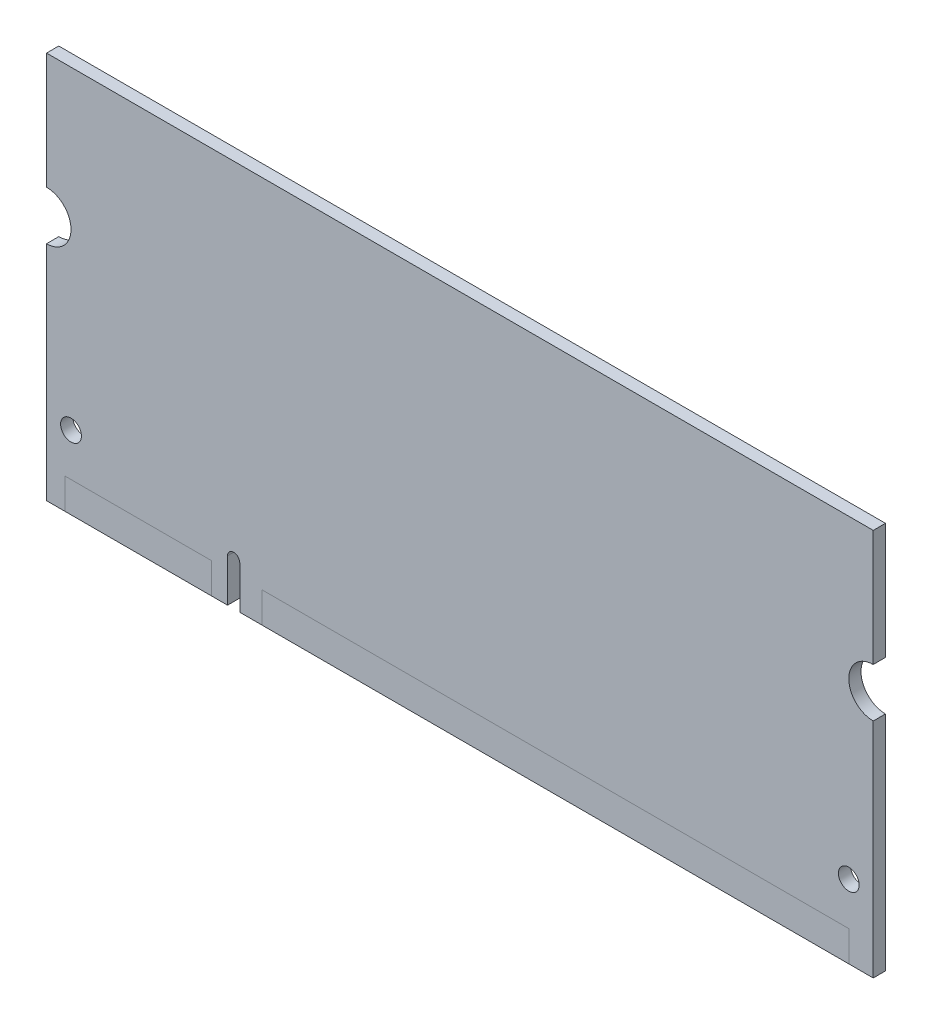
ISO-10303-21;
HEADER;
FILE_DESCRIPTION(('STEP AP214'),'2;1');
FILE_NAME('part.step','',(''),(''),'','','');
FILE_SCHEMA(('AUTOMOTIVE_DESIGN { 1 0 10303 214 1 1 1 1 }'));
ENDSEC;
DATA;
#1=APPLICATION_CONTEXT('core data for automotive mechanical design processes');
#2=APPLICATION_PROTOCOL_DEFINITION('international standard','automotive_design',2000,#1);
#3=PRODUCT_CONTEXT('',#1,'mechanical');
#4=PRODUCT('Part','Part','',(#3));
#5=PRODUCT_RELATED_PRODUCT_CATEGORY('part','',(#4));
#6=PRODUCT_DEFINITION_FORMATION('','',#4);
#7=PRODUCT_DEFINITION_CONTEXT('part definition',#1,'design');
#8=PRODUCT_DEFINITION('design','',#6,#7);
#9=PRODUCT_DEFINITION_SHAPE('','',#8);
#10=(LENGTH_UNIT() NAMED_UNIT(*) SI_UNIT(.MILLI.,.METRE.));
#11=(NAMED_UNIT(*) PLANE_ANGLE_UNIT() SI_UNIT($,.RADIAN.));
#12=(NAMED_UNIT(*) SI_UNIT($,.STERADIAN.) SOLID_ANGLE_UNIT());
#13=UNCERTAINTY_MEASURE_WITH_UNIT(LENGTH_MEASURE(1.E-05),#10,'distance_accuracy_value','');
#14=(GEOMETRIC_REPRESENTATION_CONTEXT(3) GLOBAL_UNCERTAINTY_ASSIGNED_CONTEXT((#13)) GLOBAL_UNIT_ASSIGNED_CONTEXT((#10,
#11,#12)) REPRESENTATION_CONTEXT('',''));
#15=CARTESIAN_POINT('',(0.,0.,0.));
#16=DIRECTION('',(0.,0.,1.));
#17=DIRECTION('',(1.,0.,0.));
#18=AXIS2_PLACEMENT_3D('',#15,#16,#17);
#19=CARTESIAN_POINT('',(-33.8,-15.85,-0.5));
#20=DIRECTION('',(0.,0.,1.));
#21=DIRECTION('',(1.,0.,0.));
#22=AXIS2_PLACEMENT_3D('',#19,#20,#21);
#23=PLANE('',#22);
#24=CARTESIAN_POINT('',(31.8,-9.85,-0.5));
#25=DIRECTION('',(0.,0.,1.));
#26=DIRECTION('',(1.,0.,0.));
#27=AXIS2_PLACEMENT_3D('',#24,#25,#26);
#28=CIRCLE('',#27,0.849999999999997);
#29=CARTESIAN_POINT('',(32.65,-9.85,-0.5));
#30=VERTEX_POINT('',#29);
#31=EDGE_CURVE('E256',#30,#30,#28,.T.);
#32=ORIENTED_EDGE('',*,*,#31,.T.);
#33=EDGE_LOOP('',(#32));
#34=FACE_BOUND('',#33,.T.);
#35=CARTESIAN_POINT('',(-31.8,-9.85,-0.5));
#36=DIRECTION('',(0.,0.,1.));
#37=DIRECTION('',(1.,0.,0.));
#38=AXIS2_PLACEMENT_3D('',#35,#36,#37);
#39=CIRCLE('',#38,0.85);
#40=CARTESIAN_POINT('',(-30.95,-9.85,-0.5));
#41=VERTEX_POINT('',#40);
#42=EDGE_CURVE('E262',#41,#41,#39,.T.);
#43=ORIENTED_EDGE('',*,*,#42,.T.);
#44=EDGE_LOOP('',(#43));
#45=FACE_BOUND('',#44,.T.);
#46=DIRECTION('',(0.,1.,0.));
#47=VECTOR('',#46,1.);
#48=CARTESIAN_POINT('',(-16.2,-15.85,-0.5));
#49=LINE('',#48,#47);
#50=CARTESIAN_POINT('',(-16.2,-15.85,-0.5));
#51=VERTEX_POINT('',#50);
#52=CARTESIAN_POINT('',(-16.2,-13.35,-0.5));
#53=VERTEX_POINT('',#52);
#54=EDGE_CURVE('E11',#51,#53,#49,.T.);
#55=ORIENTED_EDGE('',*,*,#54,.F.);
#56=DIRECTION('',(1.,0.,0.));
#57=VECTOR('',#56,1.);
#58=CARTESIAN_POINT('',(-33.8,-15.85,-0.5));
#59=LINE('',#58,#57);
#60=CARTESIAN_POINT('',(-18.,-15.85,-0.5));
#61=VERTEX_POINT('',#60);
#62=EDGE_CURVE('E201',#61,#51,#59,.T.);
#63=ORIENTED_EDGE('',*,*,#62,.F.);
#64=DIRECTION('',(0.,1.,0.));
#65=VECTOR('',#64,1.);
#66=CARTESIAN_POINT('',(-18.,-12.35,-0.5));
#67=LINE('',#66,#65);
#68=CARTESIAN_POINT('',(-18.,-12.35,-0.5));
#69=VERTEX_POINT('',#68);
#70=EDGE_CURVE('E184',#61,#69,#67,.T.);
#71=ORIENTED_EDGE('',*,*,#70,.T.);
#72=CARTESIAN_POINT('',(-18.5,-12.35,-0.5));
#73=DIRECTION('',(0.,0.,1.));
#74=DIRECTION('',(-1.,0.,0.));
#75=AXIS2_PLACEMENT_3D('',#72,#73,#74);
#76=CIRCLE('',#75,0.5);
#77=CARTESIAN_POINT('',(-19.,-12.35,-0.5));
#78=VERTEX_POINT('',#77);
#79=EDGE_CURVE('E193',#69,#78,#76,.T.);
#80=ORIENTED_EDGE('',*,*,#79,.T.);
#81=DIRECTION('',(0.,-1.,0.));
#82=VECTOR('',#81,1.);
#83=CARTESIAN_POINT('',(-19.,-15.85,-0.5));
#84=LINE('',#83,#82);
#85=CARTESIAN_POINT('',(-19.,-15.85,-0.5));
#86=VERTEX_POINT('',#85);
#87=EDGE_CURVE('E205',#78,#86,#84,.T.);
#88=ORIENTED_EDGE('',*,*,#87,.T.);
#89=CARTESIAN_POINT('',(-20.3,-15.85,-0.5));
#90=VERTEX_POINT('',#89);
#91=EDGE_CURVE('E207',#90,#86,#59,.T.);
#92=ORIENTED_EDGE('',*,*,#91,.F.);
#93=DIRECTION('',(0.,-1.,0.));
#94=VECTOR('',#93,1.);
#95=CARTESIAN_POINT('',(-20.3,-15.85,-0.5));
#96=LINE('',#95,#94);
#97=CARTESIAN_POINT('',(-20.3,-13.35,-0.5));
#98=VERTEX_POINT('',#97);
#99=EDGE_CURVE('E231',#98,#90,#96,.T.);
#100=ORIENTED_EDGE('',*,*,#99,.F.);
#101=DIRECTION('',(1.,0.,0.));
#102=VECTOR('',#101,1.);
#103=CARTESIAN_POINT('',(-33.8,-13.35,-0.5));
#104=LINE('',#103,#102);
#105=CARTESIAN_POINT('',(-32.3,-13.35,-0.5));
#106=VERTEX_POINT('',#105);
#107=EDGE_CURVE('E232',#106,#98,#104,.T.);
#108=ORIENTED_EDGE('',*,*,#107,.F.);
#109=DIRECTION('',(0.,1.,0.));
#110=VECTOR('',#109,1.);
#111=CARTESIAN_POINT('',(-32.3,-15.85,-0.5));
#112=LINE('',#111,#110);
#113=CARTESIAN_POINT('',(-32.3,-15.85,-0.5));
#114=VERTEX_POINT('',#113);
#115=EDGE_CURVE('E229',#114,#106,#112,.T.);
#116=ORIENTED_EDGE('',*,*,#115,.F.);
#117=CARTESIAN_POINT('',(-33.8,-15.85,-0.5));
#118=VERTEX_POINT('',#117);
#119=EDGE_CURVE('E210',#118,#114,#59,.T.);
#120=ORIENTED_EDGE('',*,*,#119,.F.);
#121=DIRECTION('',(0.,-1.,0.));
#122=VECTOR('',#121,1.);
#123=CARTESIAN_POINT('',(-33.8,15.85,-0.5));
#124=LINE('',#123,#122);
#125=CARTESIAN_POINT('',(-33.8,2.35,-0.5));
#126=VERTEX_POINT('',#125);
#127=EDGE_CURVE('E283',#126,#118,#124,.T.);
#128=ORIENTED_EDGE('',*,*,#127,.F.);
#129=CARTESIAN_POINT('',(-33.8,4.35,-0.5));
#130=DIRECTION('',(0.,0.,1.));
#131=DIRECTION('',(-1.,0.,0.));
#132=AXIS2_PLACEMENT_3D('',#129,#130,#131);
#133=CIRCLE('',#132,2.);
#134=CARTESIAN_POINT('',(-33.8,6.34999999999999,-0.5));
#135=VERTEX_POINT('',#134);
#136=EDGE_CURVE('E276',#126,#135,#133,.T.);
#137=ORIENTED_EDGE('',*,*,#136,.T.);
#138=CARTESIAN_POINT('',(-33.8,15.85,-0.5));
#139=VERTEX_POINT('',#138);
#140=EDGE_CURVE('E301',#139,#135,#124,.T.);
#141=ORIENTED_EDGE('',*,*,#140,.F.);
#142=DIRECTION('',(-1.,0.,0.));
#143=VECTOR('',#142,1.);
#144=CARTESIAN_POINT('',(-33.8,15.85,-0.5));
#145=LINE('',#144,#143);
#146=CARTESIAN_POINT('',(33.8,15.85,-0.5));
#147=VERTEX_POINT('',#146);
#148=EDGE_CURVE('E394',#147,#139,#145,.T.);
#149=ORIENTED_EDGE('',*,*,#148,.F.);
#150=DIRECTION('',(0.,1.,0.));
#151=VECTOR('',#150,1.);
#152=CARTESIAN_POINT('',(33.8,15.85,-0.5));
#153=LINE('',#152,#151);
#154=CARTESIAN_POINT('',(33.8,6.35000000000044,-0.5));
#155=VERTEX_POINT('',#154);
#156=EDGE_CURVE('E216',#155,#147,#153,.T.);
#157=ORIENTED_EDGE('',*,*,#156,.F.);
#158=CARTESIAN_POINT('',(33.8,4.35000000000044,-0.5));
#159=DIRECTION('',(0.,0.,1.));
#160=DIRECTION('',(1.,0.,0.));
#161=AXIS2_PLACEMENT_3D('',#158,#159,#160);
#162=CIRCLE('',#161,2.);
#163=CARTESIAN_POINT('',(33.8,2.35000000000044,-0.5));
#164=VERTEX_POINT('',#163);
#165=EDGE_CURVE('E266',#155,#164,#162,.T.);
#166=ORIENTED_EDGE('',*,*,#165,.T.);
#167=CARTESIAN_POINT('',(33.8,-15.85,-0.5));
#168=VERTEX_POINT('',#167);
#169=EDGE_CURVE('E395',#168,#164,#153,.T.);
#170=ORIENTED_EDGE('',*,*,#169,.F.);
#171=CARTESIAN_POINT('',(31.8,-15.85,-0.5));
#172=VERTEX_POINT('',#171);
#173=EDGE_CURVE('E212',#172,#168,#59,.T.);
#174=ORIENTED_EDGE('',*,*,#173,.F.);
#175=DIRECTION('',(0.,-1.,0.));
#176=VECTOR('',#175,1.);
#177=CARTESIAN_POINT('',(31.8,-15.85,-0.5));
#178=LINE('',#177,#176);
#179=CARTESIAN_POINT('',(31.8,-13.35,-0.5));
#180=VERTEX_POINT('',#179);
#181=EDGE_CURVE('E57',#180,#172,#178,.T.);
#182=ORIENTED_EDGE('',*,*,#181,.F.);
#183=DIRECTION('',(1.,0.,0.));
#184=VECTOR('',#183,1.);
#185=CARTESIAN_POINT('',(-33.8,-13.35,-0.5));
#186=LINE('',#185,#184);
#187=EDGE_CURVE('E51',#53,#180,#186,.T.);
#188=ORIENTED_EDGE('',*,*,#187,.F.);
#189=EDGE_LOOP('',(#55,#63,#71,#80,#88,#92,#100,#108,#116,#120,#128,#137,#141,#149,#157,#166,
#170,#174,#182,#188));
#190=FACE_BOUND('',#189,.T.);
#191=ADVANCED_FACE('F47',(#34,#45,#190),#23,.F.);
#192=CARTESIAN_POINT('',(-33.8,-15.85,0.5));
#193=DIRECTION('',(0.,0.,1.));
#194=DIRECTION('',(1.,0.,0.));
#195=AXIS2_PLACEMENT_3D('',#192,#193,#194);
#196=PLANE('',#195);
#197=CARTESIAN_POINT('',(31.8,-9.85,0.500000000000001));
#198=DIRECTION('',(0.,0.,1.));
#199=DIRECTION('',(1.,0.,0.));
#200=AXIS2_PLACEMENT_3D('',#197,#198,#199);
#201=CIRCLE('',#200,0.84999999999999);
#202=CARTESIAN_POINT('',(32.65,-9.85,0.500000000000001));
#203=VERTEX_POINT('',#202);
#204=EDGE_CURVE('E250',#203,#203,#201,.T.);
#205=ORIENTED_EDGE('',*,*,#204,.F.);
#206=EDGE_LOOP('',(#205));
#207=FACE_BOUND('',#206,.T.);
#208=CARTESIAN_POINT('',(-31.8,-9.85,0.500000000000001));
#209=DIRECTION('',(0.,0.,1.));
#210=DIRECTION('',(1.,0.,0.));
#211=AXIS2_PLACEMENT_3D('',#208,#209,#210);
#212=CIRCLE('',#211,0.84999999999999);
#213=CARTESIAN_POINT('',(-30.95,-9.85,0.500000000000001));
#214=VERTEX_POINT('',#213);
#215=EDGE_CURVE('E259',#214,#214,#212,.T.);
#216=ORIENTED_EDGE('',*,*,#215,.F.);
#217=EDGE_LOOP('',(#216));
#218=FACE_BOUND('',#217,.T.);
#219=DIRECTION('',(1.,0.,0.));
#220=VECTOR('',#219,1.);
#221=CARTESIAN_POINT('',(-33.8,-15.85,0.5));
#222=LINE('',#221,#220);
#223=CARTESIAN_POINT('',(-18.,-15.85,0.5));
#224=VERTEX_POINT('',#223);
#225=CARTESIAN_POINT('',(-16.2,-15.85,0.5));
#226=VERTEX_POINT('',#225);
#227=EDGE_CURVE('E204',#224,#226,#222,.T.);
#228=ORIENTED_EDGE('',*,*,#227,.T.);
#229=DIRECTION('',(0.,1.,0.));
#230=VECTOR('',#229,1.);
#231=CARTESIAN_POINT('',(-16.2,-15.85,0.5));
#232=LINE('',#231,#230);
#233=CARTESIAN_POINT('',(-16.2,-13.35,0.5));
#234=VERTEX_POINT('',#233);
#235=EDGE_CURVE('E342',#226,#234,#232,.T.);
#236=ORIENTED_EDGE('',*,*,#235,.T.);
#237=DIRECTION('',(1.,0.,0.));
#238=VECTOR('',#237,1.);
#239=CARTESIAN_POINT('',(-33.8,-13.35,0.5));
#240=LINE('',#239,#238);
#241=CARTESIAN_POINT('',(31.8,-13.35,0.5));
#242=VERTEX_POINT('',#241);
#243=EDGE_CURVE('E332',#234,#242,#240,.T.);
#244=ORIENTED_EDGE('',*,*,#243,.T.);
#245=DIRECTION('',(0.,-1.,0.));
#246=VECTOR('',#245,1.);
#247=CARTESIAN_POINT('',(31.8,-15.85,0.5));
#248=LINE('',#247,#246);
#249=CARTESIAN_POINT('',(31.8,-15.85,0.5));
#250=VERTEX_POINT('',#249);
#251=EDGE_CURVE('E339',#242,#250,#248,.T.);
#252=ORIENTED_EDGE('',*,*,#251,.T.);
#253=CARTESIAN_POINT('',(33.8,-15.85,0.5));
#254=VERTEX_POINT('',#253);
#255=EDGE_CURVE('E289',#250,#254,#222,.T.);
#256=ORIENTED_EDGE('',*,*,#255,.T.);
#257=DIRECTION('',(0.,1.,0.));
#258=VECTOR('',#257,1.);
#259=CARTESIAN_POINT('',(33.8,15.85,0.5));
#260=LINE('',#259,#258);
#261=CARTESIAN_POINT('',(33.8,2.35000000000044,0.5));
#262=VERTEX_POINT('',#261);
#263=EDGE_CURVE('E296',#254,#262,#260,.T.);
#264=ORIENTED_EDGE('',*,*,#263,.T.);
#265=CARTESIAN_POINT('',(33.8,4.35000000000044,0.5));
#266=DIRECTION('',(0.,0.,1.));
#267=DIRECTION('',(1.,0.,0.));
#268=AXIS2_PLACEMENT_3D('',#265,#266,#267);
#269=CIRCLE('',#268,2.);
#270=CARTESIAN_POINT('',(33.8,6.35000000000044,0.5));
#271=VERTEX_POINT('',#270);
#272=EDGE_CURVE('E265',#271,#262,#269,.T.);
#273=ORIENTED_EDGE('',*,*,#272,.F.);
#274=CARTESIAN_POINT('',(33.8,15.85,0.5));
#275=VERTEX_POINT('',#274);
#276=EDGE_CURVE('E294',#271,#275,#260,.T.);
#277=ORIENTED_EDGE('',*,*,#276,.T.);
#278=DIRECTION('',(-1.,0.,0.));
#279=VECTOR('',#278,1.);
#280=CARTESIAN_POINT('',(-33.8,15.85,0.5));
#281=LINE('',#280,#279);
#282=CARTESIAN_POINT('',(-33.8,15.85,0.5));
#283=VERTEX_POINT('',#282);
#284=EDGE_CURVE('E299',#275,#283,#281,.T.);
#285=ORIENTED_EDGE('',*,*,#284,.T.);
#286=DIRECTION('',(0.,-1.,0.));
#287=VECTOR('',#286,1.);
#288=CARTESIAN_POINT('',(-33.8,15.85,0.5));
#289=LINE('',#288,#287);
#290=CARTESIAN_POINT('',(-33.8,6.35,0.5));
#291=VERTEX_POINT('',#290);
#292=EDGE_CURVE('E286',#283,#291,#289,.T.);
#293=ORIENTED_EDGE('',*,*,#292,.T.);
#294=CARTESIAN_POINT('',(-33.8,4.35,0.5));
#295=DIRECTION('',(0.,0.,1.));
#296=DIRECTION('',(-1.,0.,0.));
#297=AXIS2_PLACEMENT_3D('',#294,#295,#296);
#298=CIRCLE('',#297,2.);
#299=CARTESIAN_POINT('',(-33.8,2.35,0.5));
#300=VERTEX_POINT('',#299);
#301=EDGE_CURVE('E273',#300,#291,#298,.T.);
#302=ORIENTED_EDGE('',*,*,#301,.F.);
#303=CARTESIAN_POINT('',(-33.8,-15.85,0.5));
#304=VERTEX_POINT('',#303);
#305=EDGE_CURVE('E290',#300,#304,#289,.T.);
#306=ORIENTED_EDGE('',*,*,#305,.T.);
#307=CARTESIAN_POINT('',(-32.3,-15.85,0.5));
#308=VERTEX_POINT('',#307);
#309=EDGE_CURVE('E291',#304,#308,#222,.T.);
#310=ORIENTED_EDGE('',*,*,#309,.T.);
#311=DIRECTION('',(0.,1.,0.));
#312=VECTOR('',#311,1.);
#313=CARTESIAN_POINT('',(-32.3,-15.85,0.5));
#314=LINE('',#313,#312);
#315=CARTESIAN_POINT('',(-32.3,-13.35,0.5));
#316=VERTEX_POINT('',#315);
#317=EDGE_CURVE('E328',#308,#316,#314,.T.);
#318=ORIENTED_EDGE('',*,*,#317,.T.);
#319=DIRECTION('',(1.,0.,0.));
#320=VECTOR('',#319,1.);
#321=CARTESIAN_POINT('',(-33.8,-13.35,0.5));
#322=LINE('',#321,#320);
#323=CARTESIAN_POINT('',(-20.3,-13.35,0.5));
#324=VERTEX_POINT('',#323);
#325=EDGE_CURVE('E314',#316,#324,#322,.T.);
#326=ORIENTED_EDGE('',*,*,#325,.T.);
#327=DIRECTION('',(0.,-1.,0.));
#328=VECTOR('',#327,1.);
#329=CARTESIAN_POINT('',(-20.3,-15.85,0.5));
#330=LINE('',#329,#328);
#331=CARTESIAN_POINT('',(-20.3,-15.85,0.5));
#332=VERTEX_POINT('',#331);
#333=EDGE_CURVE('E319',#324,#332,#330,.T.);
#334=ORIENTED_EDGE('',*,*,#333,.T.);
#335=CARTESIAN_POINT('',(-19.,-15.85,0.5));
#336=VERTEX_POINT('',#335);
#337=EDGE_CURVE('E386',#332,#336,#222,.T.);
#338=ORIENTED_EDGE('',*,*,#337,.T.);
#339=DIRECTION('',(0.,-1.,0.));
#340=VECTOR('',#339,1.);
#341=CARTESIAN_POINT('',(-19.,-15.85,0.5));
#342=LINE('',#341,#340);
#343=CARTESIAN_POINT('',(-19.,-12.35,0.5));
#344=VERTEX_POINT('',#343);
#345=EDGE_CURVE('E194',#344,#336,#342,.T.);
#346=ORIENTED_EDGE('',*,*,#345,.F.);
#347=CARTESIAN_POINT('',(-18.5,-12.35,0.5));
#348=DIRECTION('',(0.,0.,1.));
#349=DIRECTION('',(-1.,0.,0.));
#350=AXIS2_PLACEMENT_3D('',#347,#348,#349);
#351=CIRCLE('',#350,0.5);
#352=CARTESIAN_POINT('',(-18.,-12.35,0.5));
#353=VERTEX_POINT('',#352);
#354=EDGE_CURVE('E243',#353,#344,#351,.T.);
#355=ORIENTED_EDGE('',*,*,#354,.F.);
#356=DIRECTION('',(0.,1.,0.));
#357=VECTOR('',#356,1.);
#358=CARTESIAN_POINT('',(-18.,-12.35,0.5));
#359=LINE('',#358,#357);
#360=EDGE_CURVE('E241',#224,#353,#359,.T.);
#361=ORIENTED_EDGE('',*,*,#360,.F.);
#362=EDGE_LOOP('',(#228,#236,#244,#252,#256,#264,#273,#277,#285,#293,#302,#306,#310,#318,#326,
#334,#338,#346,#355,#361));
#363=FACE_BOUND('',#362,.T.);
#364=ADVANCED_FACE('F353',(#207,#218,#363),#196,.T.);
#365=EDGE_CURVE('E208',#51,#172,#59,.T.);
#366=ORIENTED_EDGE('',*,*,#365,.F.);
#367=ORIENTED_EDGE('',*,*,#54,.T.);
#368=ORIENTED_EDGE('',*,*,#187,.T.);
#369=ORIENTED_EDGE('',*,*,#181,.T.);
#370=EDGE_LOOP('',(#366,#367,#368,#369));
#371=FACE_BOUND('',#370,.T.);
#372=ADVANCED_FACE('F350',(#371),#23,.F.);
#373=ORIENTED_EDGE('',*,*,#235,.F.);
#374=EDGE_CURVE('E387',#226,#250,#222,.T.);
#375=ORIENTED_EDGE('',*,*,#374,.T.);
#376=ORIENTED_EDGE('',*,*,#251,.F.);
#377=ORIENTED_EDGE('',*,*,#243,.F.);
#378=EDGE_LOOP('',(#373,#375,#376,#377));
#379=FACE_BOUND('',#378,.T.);
#380=ADVANCED_FACE('F352',(#379),#196,.T.);
#381=CARTESIAN_POINT('',(-33.8,-15.85,0.5));
#382=DIRECTION('',(0.,1.,0.));
#383=DIRECTION('',(0.,0.,1.));
#384=AXIS2_PLACEMENT_3D('',#381,#382,#383);
#385=PLANE('',#384);
#386=ORIENTED_EDGE('',*,*,#119,.T.);
#387=EDGE_CURVE('E211',#114,#90,#59,.T.);
#388=ORIENTED_EDGE('',*,*,#387,.T.);
#389=ORIENTED_EDGE('',*,*,#91,.T.);
#390=DIRECTION('',(0.,0.,1.));
#391=VECTOR('',#390,1.);
#392=CARTESIAN_POINT('',(-19.,-15.85,-0.5));
#393=LINE('',#392,#391);
#394=EDGE_CURVE('E248',#86,#336,#393,.T.);
#395=ORIENTED_EDGE('',*,*,#394,.T.);
#396=ORIENTED_EDGE('',*,*,#337,.F.);
#397=EDGE_CURVE('E295',#308,#332,#222,.T.);
#398=ORIENTED_EDGE('',*,*,#397,.F.);
#399=ORIENTED_EDGE('',*,*,#309,.F.);
#400=DIRECTION('',(0.,0.,-1.));
#401=VECTOR('',#400,1.);
#402=CARTESIAN_POINT('',(-33.8,-15.85,0.5));
#403=LINE('',#402,#401);
#404=EDGE_CURVE('E311',#304,#118,#403,.T.);
#405=ORIENTED_EDGE('',*,*,#404,.T.);
#406=EDGE_LOOP('',(#386,#388,#389,#395,#396,#398,#399,#405));
#407=FACE_BOUND('',#406,.T.);
#408=ADVANCED_FACE('F220',(#407),#385,.F.);
#409=CARTESIAN_POINT('',(33.8,15.85,0.5));
#410=DIRECTION('',(-1.,0.,0.));
#411=DIRECTION('',(0.,0.,1.));
#412=AXIS2_PLACEMENT_3D('',#409,#410,#411);
#413=PLANE('',#412);
#414=ORIENTED_EDGE('',*,*,#169,.T.);
#415=DIRECTION('',(0.,0.,1.));
#416=VECTOR('',#415,1.);
#417=CARTESIAN_POINT('',(33.8,2.35000000000044,-0.5));
#418=LINE('',#417,#416);
#419=EDGE_CURVE('E269',#164,#262,#418,.T.);
#420=ORIENTED_EDGE('',*,*,#419,.T.);
#421=ORIENTED_EDGE('',*,*,#263,.F.);
#422=DIRECTION('',(0.,0.,-1.));
#423=VECTOR('',#422,1.);
#424=CARTESIAN_POINT('',(33.8,-15.85,0.5));
#425=LINE('',#424,#423);
#426=EDGE_CURVE('E315',#254,#168,#425,.T.);
#427=ORIENTED_EDGE('',*,*,#426,.T.);
#428=EDGE_LOOP('',(#414,#420,#421,#427));
#429=FACE_BOUND('',#428,.T.);
#430=ADVANCED_FACE('F418',(#429),#413,.F.);
#431=CARTESIAN_POINT('',(-33.8,15.85,0.5));
#432=DIRECTION('',(1.,0.,0.));
#433=DIRECTION('',(0.,0.,-1.));
#434=AXIS2_PLACEMENT_3D('',#431,#432,#433);
#435=PLANE('',#434);
#436=ORIENTED_EDGE('',*,*,#140,.T.);
#437=DIRECTION('',(0.,0.,1.));
#438=VECTOR('',#437,1.);
#439=CARTESIAN_POINT('',(-33.8,6.35,-0.5));
#440=LINE('',#439,#438);
#441=EDGE_CURVE('E279',#135,#291,#440,.T.);
#442=ORIENTED_EDGE('',*,*,#441,.T.);
#443=ORIENTED_EDGE('',*,*,#292,.F.);
#444=DIRECTION('',(0.,0.,-1.));
#445=VECTOR('',#444,1.);
#446=CARTESIAN_POINT('',(-33.8,15.85,0.5));
#447=LINE('',#446,#445);
#448=EDGE_CURVE('E300',#283,#139,#447,.T.);
#449=ORIENTED_EDGE('',*,*,#448,.T.);
#450=EDGE_LOOP('',(#436,#442,#443,#449));
#451=FACE_BOUND('',#450,.T.);
#452=ADVANCED_FACE('F411',(#451),#435,.F.);
#453=ORIENTED_EDGE('',*,*,#305,.F.);
#454=DIRECTION('',(0.,0.,1.));
#455=VECTOR('',#454,1.);
#456=CARTESIAN_POINT('',(-33.8,2.35,-0.5));
#457=LINE('',#456,#455);
#458=EDGE_CURVE('E281',#126,#300,#457,.T.);
#459=ORIENTED_EDGE('',*,*,#458,.F.);
#460=ORIENTED_EDGE('',*,*,#127,.T.);
#461=ORIENTED_EDGE('',*,*,#404,.F.);
#462=EDGE_LOOP('',(#453,#459,#460,#461));
#463=FACE_BOUND('',#462,.T.);
#464=ADVANCED_FACE('F49',(#463),#435,.F.);
#465=ORIENTED_EDGE('',*,*,#227,.F.);
#466=DIRECTION('',(0.,0.,1.));
#467=VECTOR('',#466,1.);
#468=CARTESIAN_POINT('',(-18.,-15.85,-0.5));
#469=LINE('',#468,#467);
#470=EDGE_CURVE('E188',#61,#224,#469,.T.);
#471=ORIENTED_EDGE('',*,*,#470,.F.);
#472=ORIENTED_EDGE('',*,*,#62,.T.);
#473=ORIENTED_EDGE('',*,*,#365,.T.);
#474=ORIENTED_EDGE('',*,*,#173,.T.);
#475=ORIENTED_EDGE('',*,*,#426,.F.);
#476=ORIENTED_EDGE('',*,*,#255,.F.);
#477=ORIENTED_EDGE('',*,*,#374,.F.);
#478=EDGE_LOOP('',(#465,#471,#472,#473,#474,#475,#476,#477));
#479=FACE_BOUND('',#478,.T.);
#480=ADVANCED_FACE('F199',(#479),#385,.F.);
#481=ORIENTED_EDGE('',*,*,#276,.F.);
#482=DIRECTION('',(0.,0.,1.));
#483=VECTOR('',#482,1.);
#484=CARTESIAN_POINT('',(33.8,6.35000000000044,-0.5));
#485=LINE('',#484,#483);
#486=EDGE_CURVE('E271',#155,#271,#485,.T.);
#487=ORIENTED_EDGE('',*,*,#486,.F.);
#488=ORIENTED_EDGE('',*,*,#156,.T.);
#489=DIRECTION('',(0.,0.,-1.));
#490=VECTOR('',#489,1.);
#491=CARTESIAN_POINT('',(33.8,15.85,0.5));
#492=LINE('',#491,#490);
#493=EDGE_CURVE('E322',#275,#147,#492,.T.);
#494=ORIENTED_EDGE('',*,*,#493,.F.);
#495=EDGE_LOOP('',(#481,#487,#488,#494));
#496=FACE_BOUND('',#495,.T.);
#497=ADVANCED_FACE('F414',(#496),#413,.F.);
#498=CARTESIAN_POINT('',(-33.8,15.85,0.5));
#499=DIRECTION('',(0.,-1.,0.));
#500=DIRECTION('',(0.,0.,-1.));
#501=AXIS2_PLACEMENT_3D('',#498,#499,#500);
#502=PLANE('',#501);
#503=ORIENTED_EDGE('',*,*,#148,.T.);
#504=ORIENTED_EDGE('',*,*,#448,.F.);
#505=ORIENTED_EDGE('',*,*,#284,.F.);
#506=ORIENTED_EDGE('',*,*,#493,.T.);
#507=EDGE_LOOP('',(#503,#504,#505,#506));
#508=FACE_BOUND('',#507,.T.);
#509=ADVANCED_FACE('F405',(#508),#502,.F.);
#510=ORIENTED_EDGE('',*,*,#317,.F.);
#511=ORIENTED_EDGE('',*,*,#397,.T.);
#512=ORIENTED_EDGE('',*,*,#333,.F.);
#513=ORIENTED_EDGE('',*,*,#325,.F.);
#514=EDGE_LOOP('',(#510,#511,#512,#513));
#515=FACE_BOUND('',#514,.T.);
#516=ADVANCED_FACE('F360',(#515),#196,.T.);
#517=ORIENTED_EDGE('',*,*,#387,.F.);
#518=ORIENTED_EDGE('',*,*,#115,.T.);
#519=ORIENTED_EDGE('',*,*,#107,.T.);
#520=ORIENTED_EDGE('',*,*,#99,.T.);
#521=EDGE_LOOP('',(#517,#518,#519,#520));
#522=FACE_BOUND('',#521,.T.);
#523=ADVANCED_FACE('F227',(#522),#23,.F.);
#524=CARTESIAN_POINT('',(-33.8,4.35,-0.5));
#525=DIRECTION('',(0.,0.,1.));
#526=DIRECTION('',(1.,0.,0.));
#527=AXIS2_PLACEMENT_3D('',#524,#525,#526);
#528=CYLINDRICAL_SURFACE('',#527,2.);
#529=ORIENTED_EDGE('',*,*,#301,.T.);
#530=ORIENTED_EDGE('',*,*,#441,.F.);
#531=ORIENTED_EDGE('',*,*,#136,.F.);
#532=ORIENTED_EDGE('',*,*,#458,.T.);
#533=EDGE_LOOP('',(#529,#530,#531,#532));
#534=FACE_BOUND('',#533,.T.);
#535=ADVANCED_FACE('F365',(#534),#528,.F.);
#536=CARTESIAN_POINT('',(33.8,4.35000000000044,-0.5));
#537=DIRECTION('',(0.,0.,1.));
#538=DIRECTION('',(1.,0.,0.));
#539=AXIS2_PLACEMENT_3D('',#536,#537,#538);
#540=CYLINDRICAL_SURFACE('',#539,2.);
#541=ORIENTED_EDGE('',*,*,#272,.T.);
#542=ORIENTED_EDGE('',*,*,#419,.F.);
#543=ORIENTED_EDGE('',*,*,#165,.F.);
#544=ORIENTED_EDGE('',*,*,#486,.T.);
#545=EDGE_LOOP('',(#541,#542,#543,#544));
#546=FACE_BOUND('',#545,.T.);
#547=ADVANCED_FACE('F379',(#546),#540,.F.);
#548=CARTESIAN_POINT('',(-31.8,-9.85,0.5));
#549=DIRECTION('',(0.,0.,1.));
#550=DIRECTION('',(1.,0.,0.));
#551=AXIS2_PLACEMENT_3D('',#548,#549,#550);
#552=CYLINDRICAL_SURFACE('',#551,0.849999999999995);
#553=ORIENTED_EDGE('',*,*,#42,.F.);
#554=EDGE_LOOP('',(#553));
#555=FACE_BOUND('',#554,.T.);
#556=ORIENTED_EDGE('',*,*,#215,.T.);
#557=EDGE_LOOP('',(#556));
#558=FACE_BOUND('',#557,.T.);
#559=ADVANCED_FACE('F375',(#555,#558),#552,.F.);
#560=CARTESIAN_POINT('',(31.8,-9.85,0.5));
#561=DIRECTION('',(0.,0.,1.));
#562=DIRECTION('',(1.,0.,0.));
#563=AXIS2_PLACEMENT_3D('',#560,#561,#562);
#564=CYLINDRICAL_SURFACE('',#563,0.849999999999993);
#565=ORIENTED_EDGE('',*,*,#31,.F.);
#566=EDGE_LOOP('',(#565));
#567=FACE_BOUND('',#566,.T.);
#568=ORIENTED_EDGE('',*,*,#204,.T.);
#569=EDGE_LOOP('',(#568));
#570=FACE_BOUND('',#569,.T.);
#571=ADVANCED_FACE('F378',(#567,#570),#564,.F.);
#572=CARTESIAN_POINT('',(-19.,-15.85,-0.5));
#573=DIRECTION('',(-1.,0.,0.));
#574=DIRECTION('',(0.,0.,1.));
#575=AXIS2_PLACEMENT_3D('',#572,#573,#574);
#576=PLANE('',#575);
#577=ORIENTED_EDGE('',*,*,#345,.T.);
#578=ORIENTED_EDGE('',*,*,#394,.F.);
#579=ORIENTED_EDGE('',*,*,#87,.F.);
#580=DIRECTION('',(0.,0.,1.));
#581=VECTOR('',#580,1.);
#582=CARTESIAN_POINT('',(-19.,-12.35,-0.5));
#583=LINE('',#582,#581);
#584=EDGE_CURVE('E251',#78,#344,#583,.T.);
#585=ORIENTED_EDGE('',*,*,#584,.T.);
#586=EDGE_LOOP('',(#577,#578,#579,#585));
#587=FACE_BOUND('',#586,.T.);
#588=ADVANCED_FACE('F481',(#587),#576,.F.);
#589=CARTESIAN_POINT('',(-18.5,-12.35,-0.5));
#590=DIRECTION('',(0.,0.,1.));
#591=DIRECTION('',(1.,0.,0.));
#592=AXIS2_PLACEMENT_3D('',#589,#590,#591);
#593=CYLINDRICAL_SURFACE('',#592,0.5);
#594=ORIENTED_EDGE('',*,*,#354,.T.);
#595=ORIENTED_EDGE('',*,*,#584,.F.);
#596=ORIENTED_EDGE('',*,*,#79,.F.);
#597=DIRECTION('',(0.,0.,1.));
#598=VECTOR('',#597,1.);
#599=CARTESIAN_POINT('',(-18.,-12.35,-0.5));
#600=LINE('',#599,#598);
#601=EDGE_CURVE('E190',#69,#353,#600,.T.);
#602=ORIENTED_EDGE('',*,*,#601,.T.);
#603=EDGE_LOOP('',(#594,#595,#596,#602));
#604=FACE_BOUND('',#603,.T.);
#605=ADVANCED_FACE('F498',(#604),#593,.F.);
#606=CARTESIAN_POINT('',(-18.,-12.35,-0.5));
#607=DIRECTION('',(1.,0.,0.));
#608=DIRECTION('',(0.,0.,-1.));
#609=AXIS2_PLACEMENT_3D('',#606,#607,#608);
#610=PLANE('',#609);
#611=ORIENTED_EDGE('',*,*,#360,.T.);
#612=ORIENTED_EDGE('',*,*,#601,.F.);
#613=ORIENTED_EDGE('',*,*,#70,.F.);
#614=ORIENTED_EDGE('',*,*,#470,.T.);
#615=EDGE_LOOP('',(#611,#612,#613,#614));
#616=FACE_BOUND('',#615,.T.);
#617=ADVANCED_FACE('F187',(#616),#610,.F.);
#618=CLOSED_SHELL('',(#191,#364,#372,#380,#408,#430,#452,#464,#480,#497,#509,#516,#523,#535,
#547,#559,#571,#588,#605,#617));
#619=MANIFOLD_SOLID_BREP('B2',#618);
#620=ADVANCED_BREP_SHAPE_REPRESENTATION('',(#18,#619),#14);
#621=SHAPE_DEFINITION_REPRESENTATION(#9,#620);
ENDSEC;
END-ISO-10303-21;
